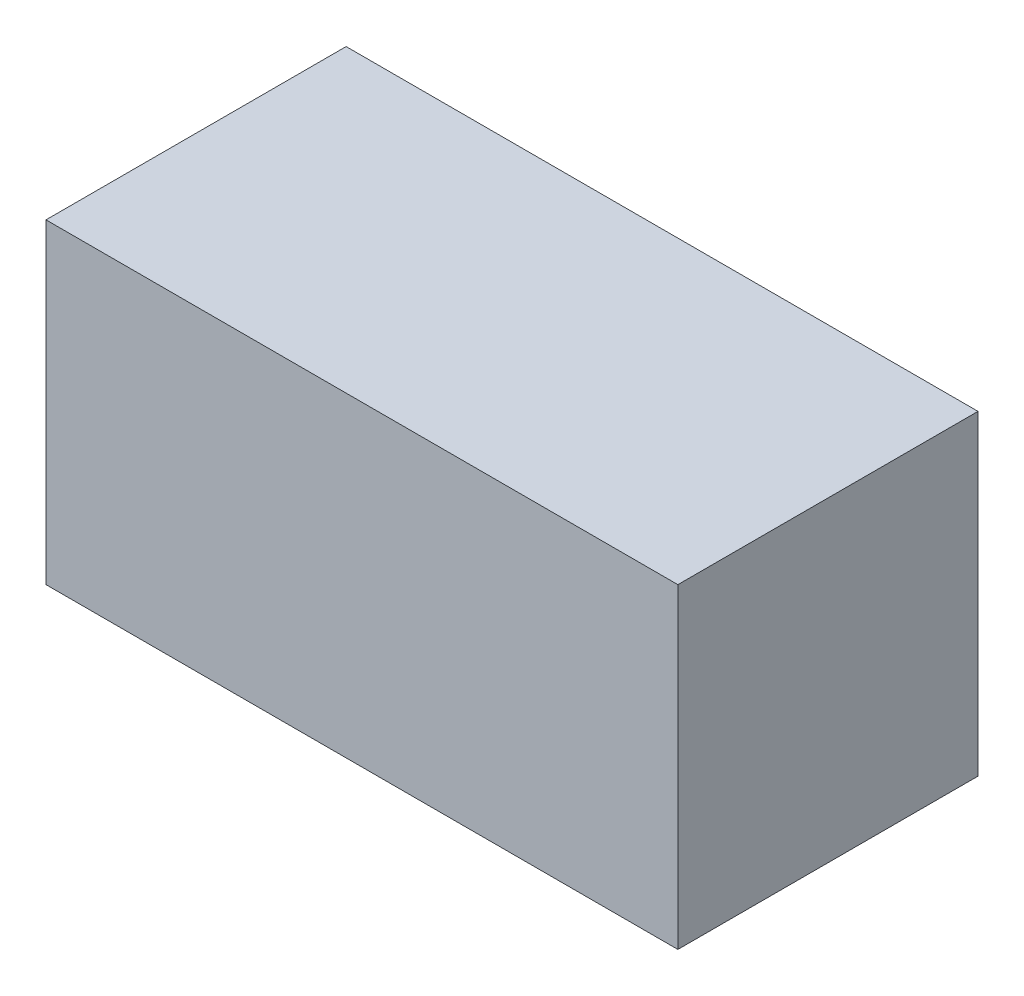
ISO-10303-21;
HEADER;
FILE_DESCRIPTION(('STEP AP214'),'2;1');
FILE_NAME('part.step','',(''),(''),'','','');
FILE_SCHEMA(('AUTOMOTIVE_DESIGN { 1 0 10303 214 1 1 1 1 }'));
ENDSEC;
DATA;
#1=APPLICATION_CONTEXT('core data for automotive mechanical design processes');
#2=APPLICATION_PROTOCOL_DEFINITION('international standard','automotive_design',2000,#1);
#3=PRODUCT_CONTEXT('',#1,'mechanical');
#4=PRODUCT('Part','Part','',(#3));
#5=PRODUCT_RELATED_PRODUCT_CATEGORY('part','',(#4));
#6=PRODUCT_DEFINITION_FORMATION('','',#4);
#7=PRODUCT_DEFINITION_CONTEXT('part definition',#1,'design');
#8=PRODUCT_DEFINITION('design','',#6,#7);
#9=PRODUCT_DEFINITION_SHAPE('','',#8);
#10=(LENGTH_UNIT() NAMED_UNIT(*) SI_UNIT(.MILLI.,.METRE.));
#11=(NAMED_UNIT(*) PLANE_ANGLE_UNIT() SI_UNIT($,.RADIAN.));
#12=(NAMED_UNIT(*) SI_UNIT($,.STERADIAN.) SOLID_ANGLE_UNIT());
#13=UNCERTAINTY_MEASURE_WITH_UNIT(LENGTH_MEASURE(1.E-05),#10,'distance_accuracy_value','');
#14=(GEOMETRIC_REPRESENTATION_CONTEXT(3) GLOBAL_UNCERTAINTY_ASSIGNED_CONTEXT((#13)) GLOBAL_UNIT_ASSIGNED_CONTEXT((#10,
#11,#12)) REPRESENTATION_CONTEXT('',''));
#15=CARTESIAN_POINT('',(0.,0.,0.));
#16=DIRECTION('',(0.,0.,1.));
#17=DIRECTION('',(1.,0.,0.));
#18=AXIS2_PLACEMENT_3D('',#15,#16,#17);
#19=CARTESIAN_POINT('',(0.,0.,19.));
#20=DIRECTION('',(1.,0.,0.));
#21=DIRECTION('',(0.,0.,-1.));
#22=AXIS2_PLACEMENT_3D('',#19,#20,#21);
#23=PLANE('',#22);
#24=DIRECTION('',(0.,-1.,0.));
#25=VECTOR('',#24,1.);
#26=CARTESIAN_POINT('',(0.,0.,0.));
#27=LINE('',#26,#25);
#28=CARTESIAN_POINT('',(0.,20.,0.));
#29=VERTEX_POINT('',#28);
#30=CARTESIAN_POINT('',(0.,0.,0.));
#31=VERTEX_POINT('',#30);
#32=EDGE_CURVE('E106',#29,#31,#27,.T.);
#33=ORIENTED_EDGE('',*,*,#32,.T.);
#34=DIRECTION('',(0.,0.,-1.));
#35=VECTOR('',#34,1.);
#36=CARTESIAN_POINT('',(0.,0.,19.));
#37=LINE('',#36,#35);
#38=CARTESIAN_POINT('',(0.,0.,19.));
#39=VERTEX_POINT('',#38);
#40=EDGE_CURVE('E11',#39,#31,#37,.T.);
#41=ORIENTED_EDGE('',*,*,#40,.F.);
#42=DIRECTION('',(0.,-1.,0.));
#43=VECTOR('',#42,1.);
#44=CARTESIAN_POINT('',(0.,0.,19.));
#45=LINE('',#44,#43);
#46=CARTESIAN_POINT('',(0.,20.,19.));
#47=VERTEX_POINT('',#46);
#48=EDGE_CURVE('E92',#47,#39,#45,.T.);
#49=ORIENTED_EDGE('',*,*,#48,.F.);
#50=DIRECTION('',(0.,0.,-1.));
#51=VECTOR('',#50,1.);
#52=CARTESIAN_POINT('',(0.,20.,19.));
#53=LINE('',#52,#51);
#54=EDGE_CURVE('E105',#47,#29,#53,.T.);
#55=ORIENTED_EDGE('',*,*,#54,.T.);
#56=EDGE_LOOP('',(#33,#41,#49,#55));
#57=FACE_BOUND('',#56,.T.);
#58=ADVANCED_FACE('F43',(#57),#23,.F.);
#59=CARTESIAN_POINT('',(0.,0.,19.));
#60=DIRECTION('',(0.,1.,0.));
#61=DIRECTION('',(0.,0.,1.));
#62=AXIS2_PLACEMENT_3D('',#59,#60,#61);
#63=PLANE('',#62);
#64=DIRECTION('',(1.,0.,0.));
#65=VECTOR('',#64,1.);
#66=CARTESIAN_POINT('',(0.,0.,0.));
#67=LINE('',#66,#65);
#68=CARTESIAN_POINT('',(40.,0.,0.));
#69=VERTEX_POINT('',#68);
#70=EDGE_CURVE('E97',#31,#69,#67,.T.);
#71=ORIENTED_EDGE('',*,*,#70,.T.);
#72=DIRECTION('',(0.,0.,-1.));
#73=VECTOR('',#72,1.);
#74=CARTESIAN_POINT('',(40.,0.,19.));
#75=LINE('',#74,#73);
#76=CARTESIAN_POINT('',(40.,0.,19.));
#77=VERTEX_POINT('',#76);
#78=EDGE_CURVE('E51',#77,#69,#75,.T.);
#79=ORIENTED_EDGE('',*,*,#78,.F.);
#80=DIRECTION('',(1.,0.,0.));
#81=VECTOR('',#80,1.);
#82=CARTESIAN_POINT('',(0.,0.,19.));
#83=LINE('',#82,#81);
#84=EDGE_CURVE('E87',#39,#77,#83,.T.);
#85=ORIENTED_EDGE('',*,*,#84,.F.);
#86=ORIENTED_EDGE('',*,*,#40,.T.);
#87=EDGE_LOOP('',(#71,#79,#85,#86));
#88=FACE_BOUND('',#87,.T.);
#89=ADVANCED_FACE('F100',(#88),#63,.F.);
#90=CARTESIAN_POINT('',(40.,0.,19.));
#91=DIRECTION('',(-1.,0.,0.));
#92=DIRECTION('',(0.,0.,1.));
#93=AXIS2_PLACEMENT_3D('',#90,#91,#92);
#94=PLANE('',#93);
#95=DIRECTION('',(0.,1.,0.));
#96=VECTOR('',#95,1.);
#97=CARTESIAN_POINT('',(40.,0.,0.));
#98=LINE('',#97,#96);
#99=CARTESIAN_POINT('',(40.,20.,0.));
#100=VERTEX_POINT('',#99);
#101=EDGE_CURVE('E78',#69,#100,#98,.T.);
#102=ORIENTED_EDGE('',*,*,#101,.T.);
#103=DIRECTION('',(0.,0.,-1.));
#104=VECTOR('',#103,1.);
#105=CARTESIAN_POINT('',(40.,20.,19.));
#106=LINE('',#105,#104);
#107=CARTESIAN_POINT('',(40.,20.,19.));
#108=VERTEX_POINT('',#107);
#109=EDGE_CURVE('E98',#108,#100,#106,.T.);
#110=ORIENTED_EDGE('',*,*,#109,.F.);
#111=DIRECTION('',(0.,1.,0.));
#112=VECTOR('',#111,1.);
#113=CARTESIAN_POINT('',(40.,0.,19.));
#114=LINE('',#113,#112);
#115=EDGE_CURVE('E95',#77,#108,#114,.T.);
#116=ORIENTED_EDGE('',*,*,#115,.F.);
#117=ORIENTED_EDGE('',*,*,#78,.T.);
#118=EDGE_LOOP('',(#102,#110,#116,#117));
#119=FACE_BOUND('',#118,.T.);
#120=ADVANCED_FACE('F99',(#119),#94,.F.);
#121=CARTESIAN_POINT('',(0.,20.,19.));
#122=DIRECTION('',(0.,-1.,0.));
#123=DIRECTION('',(0.,0.,-1.));
#124=AXIS2_PLACEMENT_3D('',#121,#122,#123);
#125=PLANE('',#124);
#126=DIRECTION('',(-1.,0.,0.));
#127=VECTOR('',#126,1.);
#128=CARTESIAN_POINT('',(0.,20.,0.));
#129=LINE('',#128,#127);
#130=EDGE_CURVE('E85',#100,#29,#129,.T.);
#131=ORIENTED_EDGE('',*,*,#130,.T.);
#132=ORIENTED_EDGE('',*,*,#54,.F.);
#133=DIRECTION('',(-1.,0.,0.));
#134=VECTOR('',#133,1.);
#135=CARTESIAN_POINT('',(0.,20.,19.));
#136=LINE('',#135,#134);
#137=EDGE_CURVE('E56',#108,#47,#136,.T.);
#138=ORIENTED_EDGE('',*,*,#137,.F.);
#139=ORIENTED_EDGE('',*,*,#109,.T.);
#140=EDGE_LOOP('',(#131,#132,#138,#139));
#141=FACE_BOUND('',#140,.T.);
#142=ADVANCED_FACE('F111',(#141),#125,.F.);
#143=CARTESIAN_POINT('',(0.,0.,19.));
#144=DIRECTION('',(0.,0.,-1.));
#145=DIRECTION('',(-1.,0.,0.));
#146=AXIS2_PLACEMENT_3D('',#143,#144,#145);
#147=PLANE('',#146);
#148=ORIENTED_EDGE('',*,*,#48,.T.);
#149=ORIENTED_EDGE('',*,*,#84,.T.);
#150=ORIENTED_EDGE('',*,*,#115,.T.);
#151=ORIENTED_EDGE('',*,*,#137,.T.);
#152=EDGE_LOOP('',(#148,#149,#150,#151));
#153=FACE_BOUND('',#152,.T.);
#154=ADVANCED_FACE('F89',(#153),#147,.F.);
#155=CARTESIAN_POINT('',(0.,0.,0.));
#156=DIRECTION('',(0.,0.,-1.));
#157=DIRECTION('',(-1.,0.,0.));
#158=AXIS2_PLACEMENT_3D('',#155,#156,#157);
#159=PLANE('',#158);
#160=ORIENTED_EDGE('',*,*,#32,.F.);
#161=ORIENTED_EDGE('',*,*,#130,.F.);
#162=ORIENTED_EDGE('',*,*,#101,.F.);
#163=ORIENTED_EDGE('',*,*,#70,.F.);
#164=EDGE_LOOP('',(#160,#161,#162,#163));
#165=FACE_BOUND('',#164,.T.);
#166=ADVANCED_FACE('F116',(#165),#159,.T.);
#167=CLOSED_SHELL('',(#58,#89,#120,#142,#154,#166));
#168=MANIFOLD_SOLID_BREP('B2',#167);
#169=ADVANCED_BREP_SHAPE_REPRESENTATION('',(#18,#168),#14);
#170=SHAPE_DEFINITION_REPRESENTATION(#9,#169);
ENDSEC;
END-ISO-10303-21;
